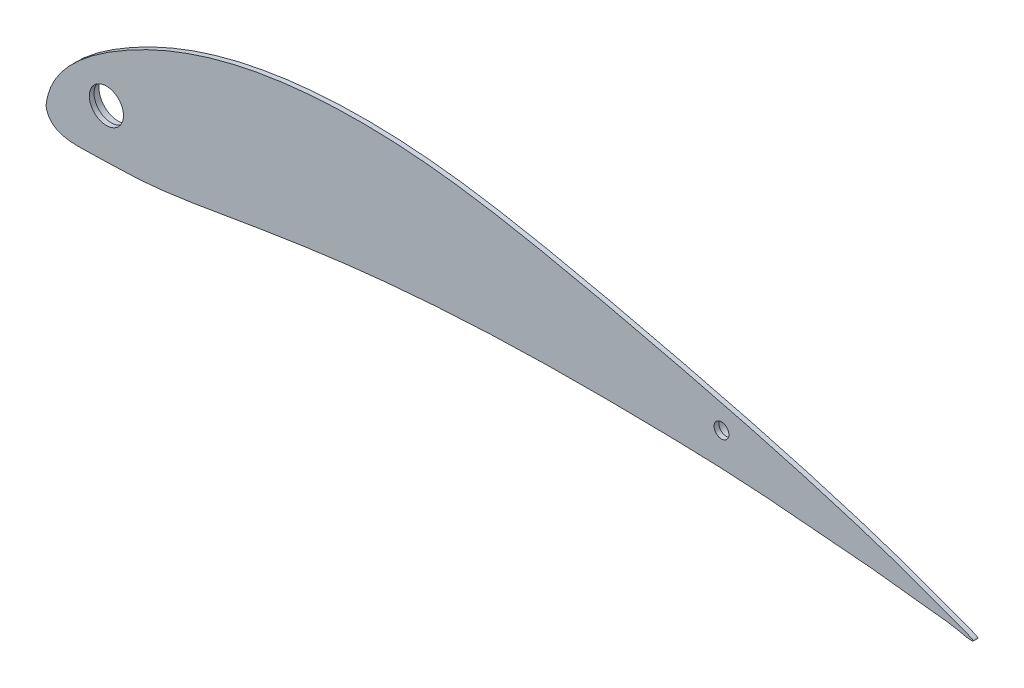
ISO-10303-21;
HEADER;
FILE_DESCRIPTION(('STEP AP214'),'2;1');
FILE_NAME('part.step','',(''),(''),'','','');
FILE_SCHEMA(('AUTOMOTIVE_DESIGN { 1 0 10303 214 1 1 1 1 }'));
ENDSEC;
DATA;
#1=APPLICATION_CONTEXT('core data for automotive mechanical design processes');
#2=APPLICATION_PROTOCOL_DEFINITION('international standard','automotive_design',2000,#1);
#3=PRODUCT_CONTEXT('',#1,'mechanical');
#4=PRODUCT('Part','Part','',(#3));
#5=PRODUCT_RELATED_PRODUCT_CATEGORY('part','',(#4));
#6=PRODUCT_DEFINITION_FORMATION('','',#4);
#7=PRODUCT_DEFINITION_CONTEXT('part definition',#1,'design');
#8=PRODUCT_DEFINITION('design','',#6,#7);
#9=PRODUCT_DEFINITION_SHAPE('','',#8);
#10=(LENGTH_UNIT() NAMED_UNIT(*) SI_UNIT(.MILLI.,.METRE.));
#11=(NAMED_UNIT(*) PLANE_ANGLE_UNIT() SI_UNIT($,.RADIAN.));
#12=(NAMED_UNIT(*) SI_UNIT($,.STERADIAN.) SOLID_ANGLE_UNIT());
#13=UNCERTAINTY_MEASURE_WITH_UNIT(LENGTH_MEASURE(1.E-05),#10,'distance_accuracy_value','');
#14=(GEOMETRIC_REPRESENTATION_CONTEXT(3) GLOBAL_UNCERTAINTY_ASSIGNED_CONTEXT((#13)) GLOBAL_UNIT_ASSIGNED_CONTEXT((#10,
#11,#12)) REPRESENTATION_CONTEXT('',''));
#15=CARTESIAN_POINT('',(0.,0.,0.));
#16=DIRECTION('',(0.,0.,1.));
#17=DIRECTION('',(1.,0.,0.));
#18=AXIS2_PLACEMENT_3D('',#15,#16,#17);
#19=CARTESIAN_POINT('',(0.000560351162113587,0.000130087070423624,1.5875));
#20=CARTESIAN_POINT('',(1.23071418869678,-6.92407609127206,1.5875));
#21=CARTESIAN_POINT('',(15.3166033306834,-6.18906584099094,1.5875));
#22=CARTESIAN_POINT('',(36.4546728163185,-6.09849990105009,1.5875));
#23=CARTESIAN_POINT('',(66.5061971849192,-0.586669106973501,1.5875));
#24=CARTESIAN_POINT('',(110.497331171581,6.18149522271792,1.5875));
#25=CARTESIAN_POINT('',(157.718638091679,9.03065014873911,1.5875));
#26=CARTESIAN_POINT('',(205.10142463584,8.83808028186313,1.5875));
#27=CARTESIAN_POINT('',(235.858814759408,7.87030619247826,1.5875));
#28=CARTESIAN_POINT('',(260.846344817159,5.42741339404395,1.5875));
#29=CARTESIAN_POINT('',(276.264022989737,4.51435670375389,1.5875));
#30=CARTESIAN_POINT('',(293.989507544058,2.09398731346533,1.5875));
#31=CARTESIAN_POINT('',(303.956832564589,1.47095520994628,1.5875));
#32=CARTESIAN_POINT('',(309.846313894505,0.000130087070423666,1.5875));
#33=B_SPLINE_CURVE_WITH_KNOTS('',3,(#19,#20,#21,#22,#23,#24,#25,#26,#27,#28,#29,#30,#31,#32),
.UNSPECIFIED.,.F.,.F.,(4,1,1,1,1,1,1,1,1,1,1,4),(0.,0.0569078595717698,0.106482711504673,
0.214488052979465,0.341297688349143,0.535095665520157,0.664680853556909,0.794660698192775,
0.828978881532905,0.904725108725214,0.942212919019968,1.),.UNSPECIFIED.);
#34=DIRECTION('',(0.,0.,-1.));
#35=VECTOR('',#34,1.);
#36=SURFACE_OF_LINEAR_EXTRUSION('',#33,#35);
#37=CARTESIAN_POINT('',(0.000560351162113587,0.000130087070423624,0.));
#38=CARTESIAN_POINT('',(1.23071418869678,-6.92407609127206,0.));
#39=CARTESIAN_POINT('',(15.3166033306834,-6.18906584099094,0.));
#40=CARTESIAN_POINT('',(36.4546728163185,-6.09849990105009,0.));
#41=CARTESIAN_POINT('',(66.5061971849192,-0.586669106973501,0.));
#42=CARTESIAN_POINT('',(110.497331171581,6.18149522271792,0.));
#43=CARTESIAN_POINT('',(157.718638091679,9.03065014873911,0.));
#44=CARTESIAN_POINT('',(205.10142463584,8.83808028186313,0.));
#45=CARTESIAN_POINT('',(235.858814759408,7.87030619247826,0.));
#46=CARTESIAN_POINT('',(260.846344817159,5.42741339404395,0.));
#47=CARTESIAN_POINT('',(276.264022989737,4.51435670375389,0.));
#48=CARTESIAN_POINT('',(293.989507544058,2.09398731346533,0.));
#49=CARTESIAN_POINT('',(303.956832564589,1.47095520994628,0.));
#50=CARTESIAN_POINT('',(309.846313894505,0.000130087070423666,0.));
#51=B_SPLINE_CURVE_WITH_KNOTS('',3,(#37,#38,#39,#40,#41,#42,#43,#44,#45,#46,#47,#48,#49,#50),
.UNSPECIFIED.,.F.,.F.,(4,1,1,1,1,1,1,1,1,1,1,4),(0.,0.0569078595717698,0.106482711504673,
0.214488052979465,0.341297688349143,0.535095665520157,0.664680853556909,0.794660698192775,
0.828978881532905,0.904725108725214,0.942212919019968,1.),.UNSPECIFIED.);
#52=CARTESIAN_POINT('',(0.000560351162116727,0.000130087070423829,0.));
#53=VERTEX_POINT('',#52);
#54=CARTESIAN_POINT('',(309.846313894505,0.000130087070423864,0.));
#55=VERTEX_POINT('',#54);
#56=EDGE_CURVE('E88',#53,#55,#51,.T.);
#57=ORIENTED_EDGE('',*,*,#56,.T.);
#58=DIRECTION('',(0.,0.,-1.));
#59=VECTOR('',#58,1.);
#60=CARTESIAN_POINT('',(309.846313894505,0.000130087070423864,1.5875));
#61=LINE('',#60,#59);
#62=CARTESIAN_POINT('',(309.846313894505,0.000130087070423864,1.5875));
#63=VERTEX_POINT('',#62);
#64=EDGE_CURVE('E84',#63,#55,#61,.T.);
#65=ORIENTED_EDGE('',*,*,#64,.F.);
#66=CARTESIAN_POINT('',(0.000560351162116727,0.000130087070423829,1.5875));
#67=VERTEX_POINT('',#66);
#68=EDGE_CURVE('E87',#67,#63,#33,.T.);
#69=ORIENTED_EDGE('',*,*,#68,.F.);
#70=DIRECTION('',(0.,0.,-1.));
#71=VECTOR('',#70,1.);
#72=CARTESIAN_POINT('',(0.000560351162116727,0.000130087070423829,1.5875));
#73=LINE('',#72,#71);
#74=EDGE_CURVE('E81',#67,#53,#73,.T.);
#75=ORIENTED_EDGE('',*,*,#74,.T.);
#76=EDGE_LOOP('',(#57,#65,#69,#75));
#77=FACE_BOUND('',#76,.T.);
#78=ADVANCED_FACE('F48',(#77),#36,.F.);
#79=CARTESIAN_POINT('',(309.846313894505,0.000130087070423864,1.5875));
#80=CARTESIAN_POINT('',(314.816918223261,-0.51620674157964,1.5875));
#81=CARTESIAN_POINT('',(301.273197720551,4.38282813873556,1.5875));
#82=CARTESIAN_POINT('',(290.359837670022,8.71099439045776,1.5875));
#83=CARTESIAN_POINT('',(256.952064400645,19.5289209482833,1.5875));
#84=CARTESIAN_POINT('',(217.961060472083,29.6129748944238,1.5875));
#85=CARTESIAN_POINT('',(173.256699242147,40.0411042779434,1.5875));
#86=CARTESIAN_POINT('',(131.400792108858,47.8848319151037,1.5875));
#87=CARTESIAN_POINT('',(89.5976184754884,49.290763053775,1.5875));
#88=CARTESIAN_POINT('',(52.1111282710831,42.0692152748914,1.5875));
#89=CARTESIAN_POINT('',(26.2867198183782,29.9751763284633,1.5875));
#90=CARTESIAN_POINT('',(8.64909202481883,17.8566051741579,1.5875));
#91=CARTESIAN_POINT('',(0.810633126632263,7.35919605469637,1.5875));
#92=CARTESIAN_POINT('',(0.000560351162116727,0.000130087070423829,1.5875));
#93=B_SPLINE_CURVE_WITH_KNOTS('',3,(#79,#80,#81,#82,#83,#84,#85,#86,#87,#88,#89,#90,#91,#92),
.UNSPECIFIED.,.F.,.F.,(4,1,1,1,1,1,1,1,1,1,1,4),(0.,0.0239417713693992,0.070244030177139,
0.147561721425381,0.308455887006792,0.442387865106874,0.551517565626309,0.687091076796298,
0.811391258419108,0.886311735305172,0.939136382225768,1.),.UNSPECIFIED.);
#94=DIRECTION('',(0.,0.,-1.));
#95=VECTOR('',#94,1.);
#96=SURFACE_OF_LINEAR_EXTRUSION('',#93,#95);
#97=CARTESIAN_POINT('',(309.846313894505,0.000130087070423864,0.));
#98=CARTESIAN_POINT('',(314.816918223261,-0.51620674157964,0.));
#99=CARTESIAN_POINT('',(301.273197720551,4.38282813873556,0.));
#100=CARTESIAN_POINT('',(290.359837670022,8.71099439045776,0.));
#101=CARTESIAN_POINT('',(256.952064400645,19.5289209482833,0.));
#102=CARTESIAN_POINT('',(217.961060472083,29.6129748944238,0.));
#103=CARTESIAN_POINT('',(173.256699242147,40.0411042779434,0.));
#104=CARTESIAN_POINT('',(131.400792108858,47.8848319151037,0.));
#105=CARTESIAN_POINT('',(89.5976184754884,49.290763053775,0.));
#106=CARTESIAN_POINT('',(52.1111282710831,42.0692152748914,0.));
#107=CARTESIAN_POINT('',(26.2867198183782,29.9751763284633,0.));
#108=CARTESIAN_POINT('',(8.64909202481883,17.8566051741579,0.));
#109=CARTESIAN_POINT('',(0.810633126632263,7.35919605469637,0.));
#110=CARTESIAN_POINT('',(0.000560351162116727,0.000130087070423829,0.));
#111=B_SPLINE_CURVE_WITH_KNOTS('',3,(#97,#98,#99,#100,#101,#102,#103,#104,#105,#106,#107,#108,
#109,#110),.UNSPECIFIED.,.F.,.F.,(4,1,1,1,1,1,1,1,1,1,1,4),(0.,0.0239417713693992,
0.070244030177139,0.147561721425381,0.308455887006792,0.442387865106874,0.551517565626309,
0.687091076796298,0.811391258419108,0.886311735305172,0.939136382225768,1.),.UNSPECIFIED.);
#112=EDGE_CURVE('E76',#55,#53,#111,.T.);
#113=ORIENTED_EDGE('',*,*,#112,.T.);
#114=ORIENTED_EDGE('',*,*,#74,.F.);
#115=EDGE_CURVE('E68',#63,#67,#93,.T.);
#116=ORIENTED_EDGE('',*,*,#115,.F.);
#117=ORIENTED_EDGE('',*,*,#64,.T.);
#118=EDGE_LOOP('',(#113,#114,#116,#117));
#119=FACE_BOUND('',#118,.T.);
#120=ADVANCED_FACE('F80',(#119),#96,.F.);
#121=CARTESIAN_POINT('',(153.387816973495,8.33338198857885,1.5875));
#122=DIRECTION('',(0.,0.,-1.));
#123=DIRECTION('',(-1.,0.,0.));
#124=AXIS2_PLACEMENT_3D('',#121,#122,#123);
#125=PLANE('',#124);
#126=CARTESIAN_POINT('',(227.296313894505,19.0501300870704,1.5875));
#127=DIRECTION('',(0.,0.,1.));
#128=DIRECTION('',(1.,0.,0.));
#129=AXIS2_PLACEMENT_3D('',#126,#127,#128);
#130=CIRCLE('',#129,2.5);
#131=CARTESIAN_POINT('',(229.796313894505,19.0501300870704,1.5875));
#132=VERTEX_POINT('',#131);
#133=EDGE_CURVE('E319',#132,#132,#130,.T.);
#134=ORIENTED_EDGE('',*,*,#133,.F.);
#135=EDGE_LOOP('',(#134));
#136=FACE_BOUND('',#135,.T.);
#137=CARTESIAN_POINT('',(20.32,10.16,1.5875));
#138=DIRECTION('',(0.,0.,1.));
#139=DIRECTION('',(1.,0.,0.));
#140=AXIS2_PLACEMENT_3D('',#137,#138,#139);
#141=CIRCLE('',#140,5.75);
#142=CARTESIAN_POINT('',(26.07,10.16,1.5875));
#143=VERTEX_POINT('',#142);
#144=EDGE_CURVE('E323',#143,#143,#141,.T.);
#145=ORIENTED_EDGE('',*,*,#144,.F.);
#146=EDGE_LOOP('',(#145));
#147=FACE_BOUND('',#146,.T.);
#148=ORIENTED_EDGE('',*,*,#68,.T.);
#149=ORIENTED_EDGE('',*,*,#115,.T.);
#150=EDGE_LOOP('',(#148,#149));
#151=FACE_BOUND('',#150,.T.);
#152=ADVANCED_FACE('F158',(#136,#147,#151),#125,.F.);
#153=CARTESIAN_POINT('',(153.387816973495,8.33338198857885,0.));
#154=DIRECTION('',(0.,0.,-1.));
#155=DIRECTION('',(-1.,0.,0.));
#156=AXIS2_PLACEMENT_3D('',#153,#154,#155);
#157=PLANE('',#156);
#158=CARTESIAN_POINT('',(20.32,10.16,0.));
#159=DIRECTION('',(0.,0.,-1.));
#160=DIRECTION('',(-1.,0.,0.));
#161=AXIS2_PLACEMENT_3D('',#158,#159,#160);
#162=CIRCLE('',#161,8.);
#163=CARTESIAN_POINT('',(12.32,10.16,0.));
#164=VERTEX_POINT('',#163);
#165=EDGE_CURVE('E12',#164,#164,#162,.T.);
#166=ORIENTED_EDGE('',*,*,#165,.F.);
#167=EDGE_LOOP('',(#166));
#168=FACE_BOUND('',#167,.T.);
#169=CARTESIAN_POINT('',(227.296313894505,19.0501300870704,0.));
#170=DIRECTION('',(0.,0.,-1.));
#171=DIRECTION('',(-1.,0.,0.));
#172=AXIS2_PLACEMENT_3D('',#169,#170,#171);
#173=CIRCLE('',#172,4.49999999999999);
#174=CARTESIAN_POINT('',(222.796313894505,19.0501300870704,0.));
#175=VERTEX_POINT('',#174);
#176=EDGE_CURVE('E60',#175,#175,#173,.T.);
#177=ORIENTED_EDGE('',*,*,#176,.F.);
#178=EDGE_LOOP('',(#177));
#179=FACE_BOUND('',#178,.T.);
#180=ORIENTED_EDGE('',*,*,#56,.F.);
#181=ORIENTED_EDGE('',*,*,#112,.F.);
#182=EDGE_LOOP('',(#180,#181));
#183=FACE_BOUND('',#182,.T.);
#184=ADVANCED_FACE('F93',(#168,#179,#183),#157,.T.);
#185=CARTESIAN_POINT('',(227.296313894505,19.0501300870704,-2.4125));
#186=DIRECTION('',(0.,0.,1.));
#187=DIRECTION('',(1.,0.,0.));
#188=AXIS2_PLACEMENT_3D('',#185,#186,#187);
#189=CYLINDRICAL_SURFACE('',#188,2.99999999999999);
#190=CARTESIAN_POINT('',(227.296313894505,19.0501300870704,0.));
#191=DIRECTION('',(0.,0.,-1.));
#192=DIRECTION('',(-1.,0.,0.));
#193=AXIS2_PLACEMENT_3D('',#190,#191,#192);
#194=CIRCLE('',#193,2.99999999999999);
#195=CARTESIAN_POINT('',(224.296313894505,19.0501300870704,0.));
#196=VERTEX_POINT('',#195);
#197=EDGE_CURVE('E95',#196,#196,#194,.T.);
#198=ORIENTED_EDGE('',*,*,#197,.F.);
#199=EDGE_LOOP('',(#198));
#200=FACE_BOUND('',#199,.T.);
#201=CARTESIAN_POINT('',(227.296313894505,19.0501300870704,-2.4125));
#202=DIRECTION('',(0.,0.,1.));
#203=DIRECTION('',(1.,0.,0.));
#204=AXIS2_PLACEMENT_3D('',#201,#202,#203);
#205=CIRCLE('',#204,2.99999999999999);
#206=CARTESIAN_POINT('',(230.296313894505,19.0501300870704,-2.4125));
#207=VERTEX_POINT('',#206);
#208=EDGE_CURVE('E132',#207,#207,#205,.T.);
#209=ORIENTED_EDGE('',*,*,#208,.F.);
#210=EDGE_LOOP('',(#209));
#211=FACE_BOUND('',#210,.T.);
#212=ADVANCED_FACE('F166',(#200,#211),#189,.F.);
#213=CARTESIAN_POINT('',(227.296313894505,19.0501300870704,-2.4125));
#214=DIRECTION('',(0.,0.,1.));
#215=DIRECTION('',(1.,0.,0.));
#216=AXIS2_PLACEMENT_3D('',#213,#214,#215);
#217=CYLINDRICAL_SURFACE('',#216,4.49999999999999);
#218=ORIENTED_EDGE('',*,*,#176,.T.);
#219=EDGE_LOOP('',(#218));
#220=FACE_BOUND('',#219,.T.);
#221=CARTESIAN_POINT('',(227.296313894505,19.0501300870704,-2.4125));
#222=DIRECTION('',(0.,0.,1.));
#223=DIRECTION('',(1.,0.,0.));
#224=AXIS2_PLACEMENT_3D('',#221,#222,#223);
#225=CIRCLE('',#224,4.49999999999999);
#226=CARTESIAN_POINT('',(231.796313894505,19.0501300870704,-2.4125));
#227=VERTEX_POINT('',#226);
#228=EDGE_CURVE('E99',#227,#227,#225,.T.);
#229=ORIENTED_EDGE('',*,*,#228,.T.);
#230=EDGE_LOOP('',(#229));
#231=FACE_BOUND('',#230,.T.);
#232=ADVANCED_FACE('F189',(#220,#231),#217,.T.);
#233=CARTESIAN_POINT('',(0.,0.,-2.4125));
#234=DIRECTION('',(0.,0.,1.));
#235=DIRECTION('',(1.,0.,0.));
#236=AXIS2_PLACEMENT_3D('',#233,#234,#235);
#237=PLANE('',#236);
#238=ORIENTED_EDGE('',*,*,#208,.T.);
#239=EDGE_LOOP('',(#238));
#240=FACE_BOUND('',#239,.T.);
#241=ORIENTED_EDGE('',*,*,#228,.F.);
#242=EDGE_LOOP('',(#241));
#243=FACE_BOUND('',#242,.T.);
#244=ADVANCED_FACE('F246',(#240,#243),#237,.F.);
#245=CARTESIAN_POINT('',(227.296313894505,19.0501300870704,0.));
#246=DIRECTION('',(0.,0.,-1.));
#247=DIRECTION('',(-1.,0.,0.));
#248=AXIS2_PLACEMENT_3D('',#245,#246,#247);
#249=CIRCLE('',#248,2.5);
#250=CARTESIAN_POINT('',(224.796313894505,19.0501300870704,0.));
#251=VERTEX_POINT('',#250);
#252=EDGE_CURVE('E52',#251,#251,#249,.T.);
#253=ORIENTED_EDGE('',*,*,#252,.F.);
#254=EDGE_LOOP('',(#253));
#255=FACE_BOUND('',#254,.T.);
#256=ORIENTED_EDGE('',*,*,#197,.T.);
#257=EDGE_LOOP('',(#256));
#258=FACE_BOUND('',#257,.T.);
#259=ADVANCED_FACE('F170',(#255,#258),#157,.T.);
#260=CARTESIAN_POINT('',(20.32,10.16,-2.4125));
#261=DIRECTION('',(0.,0.,1.));
#262=DIRECTION('',(1.,0.,0.));
#263=AXIS2_PLACEMENT_3D('',#260,#261,#262);
#264=CYLINDRICAL_SURFACE('',#263,6.5);
#265=CARTESIAN_POINT('',(20.32,10.16,0.));
#266=DIRECTION('',(0.,0.,-1.));
#267=DIRECTION('',(-1.,0.,0.));
#268=AXIS2_PLACEMENT_3D('',#265,#266,#267);
#269=CIRCLE('',#268,6.5);
#270=CARTESIAN_POINT('',(13.82,10.16,0.));
#271=VERTEX_POINT('',#270);
#272=EDGE_CURVE('E128',#271,#271,#269,.T.);
#273=ORIENTED_EDGE('',*,*,#272,.F.);
#274=EDGE_LOOP('',(#273));
#275=FACE_BOUND('',#274,.T.);
#276=CARTESIAN_POINT('',(20.32,10.16,-2.4125));
#277=DIRECTION('',(0.,0.,1.));
#278=DIRECTION('',(1.,0.,0.));
#279=AXIS2_PLACEMENT_3D('',#276,#277,#278);
#280=CIRCLE('',#279,6.5);
#281=CARTESIAN_POINT('',(26.82,10.16,-2.4125));
#282=VERTEX_POINT('',#281);
#283=EDGE_CURVE('E142',#282,#282,#280,.T.);
#284=ORIENTED_EDGE('',*,*,#283,.F.);
#285=EDGE_LOOP('',(#284));
#286=FACE_BOUND('',#285,.T.);
#287=ADVANCED_FACE('F196',(#275,#286),#264,.F.);
#288=CARTESIAN_POINT('',(20.32,10.16,-2.4125));
#289=DIRECTION('',(0.,0.,1.));
#290=DIRECTION('',(1.,0.,0.));
#291=AXIS2_PLACEMENT_3D('',#288,#289,#290);
#292=CYLINDRICAL_SURFACE('',#291,8.);
#293=ORIENTED_EDGE('',*,*,#165,.T.);
#294=EDGE_LOOP('',(#293));
#295=FACE_BOUND('',#294,.T.);
#296=CARTESIAN_POINT('',(20.32,10.16,-2.4125));
#297=DIRECTION('',(0.,0.,1.));
#298=DIRECTION('',(1.,0.,0.));
#299=AXIS2_PLACEMENT_3D('',#296,#297,#298);
#300=CIRCLE('',#299,8.);
#301=CARTESIAN_POINT('',(28.32,10.16,-2.4125));
#302=VERTEX_POINT('',#301);
#303=EDGE_CURVE('E133',#302,#302,#300,.T.);
#304=ORIENTED_EDGE('',*,*,#303,.T.);
#305=EDGE_LOOP('',(#304));
#306=FACE_BOUND('',#305,.T.);
#307=ADVANCED_FACE('F199',(#295,#306),#292,.T.);
#308=CARTESIAN_POINT('',(0.,0.,-2.4125));
#309=DIRECTION('',(0.,0.,1.));
#310=DIRECTION('',(1.,0.,0.));
#311=AXIS2_PLACEMENT_3D('',#308,#309,#310);
#312=PLANE('',#311);
#313=ORIENTED_EDGE('',*,*,#283,.T.);
#314=EDGE_LOOP('',(#313));
#315=FACE_BOUND('',#314,.T.);
#316=ORIENTED_EDGE('',*,*,#303,.F.);
#317=EDGE_LOOP('',(#316));
#318=FACE_BOUND('',#317,.T.);
#319=ADVANCED_FACE('F215',(#315,#318),#312,.F.);
#320=CARTESIAN_POINT('',(20.32,10.16,0.));
#321=DIRECTION('',(0.,0.,-1.));
#322=DIRECTION('',(-1.,0.,0.));
#323=AXIS2_PLACEMENT_3D('',#320,#321,#322);
#324=CIRCLE('',#323,5.75);
#325=CARTESIAN_POINT('',(14.57,10.16,0.));
#326=VERTEX_POINT('',#325);
#327=EDGE_CURVE('E134',#326,#326,#324,.T.);
#328=ORIENTED_EDGE('',*,*,#327,.F.);
#329=EDGE_LOOP('',(#328));
#330=FACE_BOUND('',#329,.T.);
#331=ORIENTED_EDGE('',*,*,#272,.T.);
#332=EDGE_LOOP('',(#331));
#333=FACE_BOUND('',#332,.T.);
#334=ADVANCED_FACE('F169',(#330,#333),#157,.T.);
#335=CARTESIAN_POINT('',(20.32,10.16,-2.4125));
#336=DIRECTION('',(0.,0.,1.));
#337=DIRECTION('',(1.,0.,0.));
#338=AXIS2_PLACEMENT_3D('',#335,#336,#337);
#339=CYLINDRICAL_SURFACE('',#338,5.75);
#340=ORIENTED_EDGE('',*,*,#327,.T.);
#341=EDGE_LOOP('',(#340));
#342=FACE_BOUND('',#341,.T.);
#343=ORIENTED_EDGE('',*,*,#144,.T.);
#344=EDGE_LOOP('',(#343));
#345=FACE_BOUND('',#344,.T.);
#346=ADVANCED_FACE('F228',(#342,#345),#339,.F.);
#347=CARTESIAN_POINT('',(227.296313894505,19.0501300870704,-2.4125));
#348=DIRECTION('',(0.,0.,1.));
#349=DIRECTION('',(1.,0.,0.));
#350=AXIS2_PLACEMENT_3D('',#347,#348,#349);
#351=CYLINDRICAL_SURFACE('',#350,2.5);
#352=ORIENTED_EDGE('',*,*,#252,.T.);
#353=EDGE_LOOP('',(#352));
#354=FACE_BOUND('',#353,.T.);
#355=ORIENTED_EDGE('',*,*,#133,.T.);
#356=EDGE_LOOP('',(#355));
#357=FACE_BOUND('',#356,.T.);
#358=ADVANCED_FACE('F234',(#354,#357),#351,.F.);
#359=CLOSED_SHELL('',(#78,#120,#152,#184,#212,#232,#244,#259,#287,#307,#319,#334,#346,#358));
#360=MANIFOLD_SOLID_BREP('B2',#359);
#361=ADVANCED_BREP_SHAPE_REPRESENTATION('',(#18,#360),#14);
#362=SHAPE_DEFINITION_REPRESENTATION(#9,#361);
ENDSEC;
END-ISO-10303-21;
